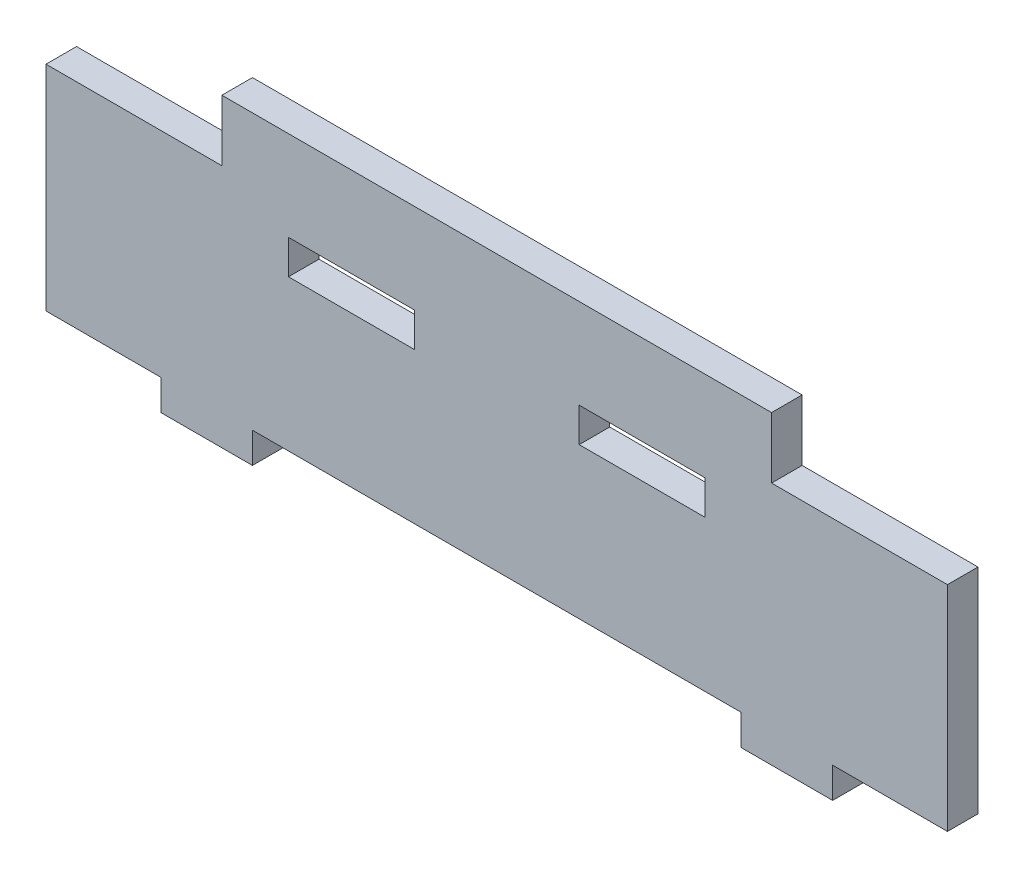
ISO-10303-21;
HEADER;
FILE_DESCRIPTION(('STEP AP214'),'2;1');
FILE_NAME('part.step','',(''),(''),'','','');
FILE_SCHEMA(('AUTOMOTIVE_DESIGN { 1 0 10303 214 1 1 1 1 }'));
ENDSEC;
DATA;
#1=APPLICATION_CONTEXT('core data for automotive mechanical design processes');
#2=APPLICATION_PROTOCOL_DEFINITION('international standard','automotive_design',2000,#1);
#3=PRODUCT_CONTEXT('',#1,'mechanical');
#4=PRODUCT('Part','Part','',(#3));
#5=PRODUCT_RELATED_PRODUCT_CATEGORY('part','',(#4));
#6=PRODUCT_DEFINITION_FORMATION('','',#4);
#7=PRODUCT_DEFINITION_CONTEXT('part definition',#1,'design');
#8=PRODUCT_DEFINITION('design','',#6,#7);
#9=PRODUCT_DEFINITION_SHAPE('','',#8);
#10=(LENGTH_UNIT() NAMED_UNIT(*) SI_UNIT(.MILLI.,.METRE.));
#11=(NAMED_UNIT(*) PLANE_ANGLE_UNIT() SI_UNIT($,.RADIAN.));
#12=(NAMED_UNIT(*) SI_UNIT($,.STERADIAN.) SOLID_ANGLE_UNIT());
#13=UNCERTAINTY_MEASURE_WITH_UNIT(LENGTH_MEASURE(1.E-05),#10,'distance_accuracy_value','');
#14=(GEOMETRIC_REPRESENTATION_CONTEXT(3) GLOBAL_UNCERTAINTY_ASSIGNED_CONTEXT((#13)) GLOBAL_UNIT_ASSIGNED_CONTEXT((#10,
#11,#12)) REPRESENTATION_CONTEXT('',''));
#15=CARTESIAN_POINT('',(0.,0.,0.));
#16=DIRECTION('',(0.,0.,1.));
#17=DIRECTION('',(1.,0.,0.));
#18=AXIS2_PLACEMENT_3D('',#15,#16,#17);
#19=CARTESIAN_POINT('',(0.,0.,5.));
#20=DIRECTION('',(0.,0.,1.));
#21=DIRECTION('',(1.,0.,0.));
#22=AXIS2_PLACEMENT_3D('',#19,#20,#21);
#23=PLANE('',#22);
#24=DIRECTION('',(0.,-1.,0.));
#25=VECTOR('',#24,1.);
#26=CARTESIAN_POINT('',(0.,0.,5.));
#27=LINE('',#26,#25);
#28=CARTESIAN_POINT('',(0.,35.,5.));
#29=VERTEX_POINT('',#28);
#30=CARTESIAN_POINT('',(0.,0.,5.));
#31=VERTEX_POINT('',#30);
#32=EDGE_CURVE('E263',#29,#31,#27,.T.);
#33=ORIENTED_EDGE('',*,*,#32,.T.);
#34=DIRECTION('',(1.,0.,0.));
#35=VECTOR('',#34,1.);
#36=CARTESIAN_POINT('',(0.,0.,5.));
#37=LINE('',#36,#35);
#38=CARTESIAN_POINT('',(18.8,0.,5.));
#39=VERTEX_POINT('',#38);
#40=EDGE_CURVE('E266',#31,#39,#37,.T.);
#41=ORIENTED_EDGE('',*,*,#40,.T.);
#42=DIRECTION('',(0.,-1.,0.));
#43=VECTOR('',#42,1.);
#44=CARTESIAN_POINT('',(18.8,-5.,5.));
#45=LINE('',#44,#43);
#46=CARTESIAN_POINT('',(18.8,-5.,5.));
#47=VERTEX_POINT('',#46);
#48=EDGE_CURVE('E269',#39,#47,#45,.T.);
#49=ORIENTED_EDGE('',*,*,#48,.T.);
#50=DIRECTION('',(1.,0.,0.));
#51=VECTOR('',#50,1.);
#52=CARTESIAN_POINT('',(18.8,-5.,5.));
#53=LINE('',#52,#51);
#54=CARTESIAN_POINT('',(33.8,-5.,5.));
#55=VERTEX_POINT('',#54);
#56=EDGE_CURVE('E271',#47,#55,#53,.T.);
#57=ORIENTED_EDGE('',*,*,#56,.T.);
#58=DIRECTION('',(0.,1.,0.));
#59=VECTOR('',#58,1.);
#60=CARTESIAN_POINT('',(33.8,-5.,5.));
#61=LINE('',#60,#59);
#62=CARTESIAN_POINT('',(33.8,0.,5.));
#63=VERTEX_POINT('',#62);
#64=EDGE_CURVE('E273',#55,#63,#61,.T.);
#65=ORIENTED_EDGE('',*,*,#64,.T.);
#66=DIRECTION('',(1.,0.,0.));
#67=VECTOR('',#66,1.);
#68=CARTESIAN_POINT('',(33.8,0.,5.));
#69=LINE('',#68,#67);
#70=CARTESIAN_POINT('',(113.8,0.,5.));
#71=VERTEX_POINT('',#70);
#72=EDGE_CURVE('E275',#63,#71,#69,.T.);
#73=ORIENTED_EDGE('',*,*,#72,.T.);
#74=DIRECTION('',(0.,-1.,0.));
#75=VECTOR('',#74,1.);
#76=CARTESIAN_POINT('',(113.8,-5.,5.));
#77=LINE('',#76,#75);
#78=CARTESIAN_POINT('',(113.8,-5.,5.));
#79=VERTEX_POINT('',#78);
#80=EDGE_CURVE('E277',#71,#79,#77,.T.);
#81=ORIENTED_EDGE('',*,*,#80,.T.);
#82=DIRECTION('',(1.,0.,0.));
#83=VECTOR('',#82,1.);
#84=CARTESIAN_POINT('',(128.8,-5.,5.));
#85=LINE('',#84,#83);
#86=CARTESIAN_POINT('',(128.8,-5.,5.));
#87=VERTEX_POINT('',#86);
#88=EDGE_CURVE('E279',#79,#87,#85,.T.);
#89=ORIENTED_EDGE('',*,*,#88,.T.);
#90=DIRECTION('',(0.,1.,0.));
#91=VECTOR('',#90,1.);
#92=CARTESIAN_POINT('',(128.8,-5.,5.));
#93=LINE('',#92,#91);
#94=CARTESIAN_POINT('',(128.8,0.,5.));
#95=VERTEX_POINT('',#94);
#96=EDGE_CURVE('E281',#87,#95,#93,.T.);
#97=ORIENTED_EDGE('',*,*,#96,.T.);
#98=DIRECTION('',(1.,0.,0.));
#99=VECTOR('',#98,1.);
#100=CARTESIAN_POINT('',(128.8,0.,5.));
#101=LINE('',#100,#99);
#102=CARTESIAN_POINT('',(147.6,0.,5.));
#103=VERTEX_POINT('',#102);
#104=EDGE_CURVE('E283',#95,#103,#101,.T.);
#105=ORIENTED_EDGE('',*,*,#104,.T.);
#106=DIRECTION('',(0.,1.,0.));
#107=VECTOR('',#106,1.);
#108=CARTESIAN_POINT('',(147.6,0.,5.));
#109=LINE('',#108,#107);
#110=CARTESIAN_POINT('',(147.6,35.,5.));
#111=VERTEX_POINT('',#110);
#112=EDGE_CURVE('E285',#103,#111,#109,.T.);
#113=ORIENTED_EDGE('',*,*,#112,.T.);
#114=DIRECTION('',(-1.,0.,0.));
#115=VECTOR('',#114,1.);
#116=CARTESIAN_POINT('',(118.8,35.,5.));
#117=LINE('',#116,#115);
#118=CARTESIAN_POINT('',(118.8,35.,5.));
#119=VERTEX_POINT('',#118);
#120=EDGE_CURVE('E287',#111,#119,#117,.T.);
#121=ORIENTED_EDGE('',*,*,#120,.T.);
#122=DIRECTION('',(0.,1.,0.));
#123=VECTOR('',#122,1.);
#124=CARTESIAN_POINT('',(118.8,45.,5.));
#125=LINE('',#124,#123);
#126=CARTESIAN_POINT('',(118.8,45.,5.));
#127=VERTEX_POINT('',#126);
#128=EDGE_CURVE('E289',#119,#127,#125,.T.);
#129=ORIENTED_EDGE('',*,*,#128,.T.);
#130=DIRECTION('',(-1.,0.,0.));
#131=VECTOR('',#130,1.);
#132=CARTESIAN_POINT('',(28.8,45.,5.));
#133=LINE('',#132,#131);
#134=CARTESIAN_POINT('',(28.8,45.,5.));
#135=VERTEX_POINT('',#134);
#136=EDGE_CURVE('E291',#127,#135,#133,.T.);
#137=ORIENTED_EDGE('',*,*,#136,.T.);
#138=DIRECTION('',(0.,-1.,0.));
#139=VECTOR('',#138,1.);
#140=CARTESIAN_POINT('',(28.8,45.,5.));
#141=LINE('',#140,#139);
#142=CARTESIAN_POINT('',(28.8,35.,5.));
#143=VERTEX_POINT('',#142);
#144=EDGE_CURVE('E293',#135,#143,#141,.T.);
#145=ORIENTED_EDGE('',*,*,#144,.T.);
#146=DIRECTION('',(-1.,0.,0.));
#147=VECTOR('',#146,1.);
#148=CARTESIAN_POINT('',(28.8,35.,5.));
#149=LINE('',#148,#147);
#150=EDGE_CURVE('E295',#143,#29,#149,.T.);
#151=ORIENTED_EDGE('',*,*,#150,.T.);
#152=EDGE_LOOP('',(#33,#41,#49,#57,#65,#73,#81,#89,#97,#105,#113,#121,#129,#137,#145,#151));
#153=FACE_BOUND('',#152,.T.);
#154=DIRECTION('',(0.,-1.,0.));
#155=VECTOR('',#154,1.);
#156=CARTESIAN_POINT('',(39.7,30.3,5.));
#157=LINE('',#156,#155);
#158=CARTESIAN_POINT('',(39.7,30.3,5.));
#159=VERTEX_POINT('',#158);
#160=CARTESIAN_POINT('',(39.7,24.7,5.));
#161=VERTEX_POINT('',#160);
#162=EDGE_CURVE('E234',#159,#161,#157,.T.);
#163=ORIENTED_EDGE('',*,*,#162,.F.);
#164=DIRECTION('',(-1.,0.,0.));
#165=VECTOR('',#164,1.);
#166=CARTESIAN_POINT('',(39.7,30.3,5.));
#167=LINE('',#166,#165);
#168=CARTESIAN_POINT('',(60.3,30.3,5.));
#169=VERTEX_POINT('',#168);
#170=EDGE_CURVE('E232',#169,#159,#167,.T.);
#171=ORIENTED_EDGE('',*,*,#170,.F.);
#172=DIRECTION('',(0.,1.,0.));
#173=VECTOR('',#172,1.);
#174=CARTESIAN_POINT('',(60.3,30.3,5.));
#175=LINE('',#174,#173);
#176=CARTESIAN_POINT('',(60.3,24.7,5.));
#177=VERTEX_POINT('',#176);
#178=EDGE_CURVE('E240',#177,#169,#175,.T.);
#179=ORIENTED_EDGE('',*,*,#178,.F.);
#180=DIRECTION('',(1.,0.,0.));
#181=VECTOR('',#180,1.);
#182=CARTESIAN_POINT('',(39.7,24.7,5.));
#183=LINE('',#182,#181);
#184=EDGE_CURVE('E237',#161,#177,#183,.T.);
#185=ORIENTED_EDGE('',*,*,#184,.F.);
#186=EDGE_LOOP('',(#163,#171,#179,#185));
#187=FACE_BOUND('',#186,.T.);
#188=DIRECTION('',(-1.,0.,0.));
#189=VECTOR('',#188,1.);
#190=CARTESIAN_POINT('',(107.9,30.3,5.));
#191=LINE('',#190,#189);
#192=CARTESIAN_POINT('',(107.9,30.3,5.));
#193=VERTEX_POINT('',#192);
#194=CARTESIAN_POINT('',(87.3,30.3,5.));
#195=VERTEX_POINT('',#194);
#196=EDGE_CURVE('E204',#193,#195,#191,.T.);
#197=ORIENTED_EDGE('',*,*,#196,.F.);
#198=DIRECTION('',(0.,1.,0.));
#199=VECTOR('',#198,1.);
#200=CARTESIAN_POINT('',(107.9,30.3,5.));
#201=LINE('',#200,#199);
#202=CARTESIAN_POINT('',(107.9,24.7,5.));
#203=VERTEX_POINT('',#202);
#204=EDGE_CURVE('E196',#203,#193,#201,.T.);
#205=ORIENTED_EDGE('',*,*,#204,.F.);
#206=DIRECTION('',(1.,0.,0.));
#207=VECTOR('',#206,1.);
#208=CARTESIAN_POINT('',(107.9,24.7,5.));
#209=LINE('',#208,#207);
#210=CARTESIAN_POINT('',(87.3,24.7,5.));
#211=VERTEX_POINT('',#210);
#212=EDGE_CURVE('E218',#211,#203,#209,.T.);
#213=ORIENTED_EDGE('',*,*,#212,.F.);
#214=DIRECTION('',(0.,-1.,0.));
#215=VECTOR('',#214,1.);
#216=CARTESIAN_POINT('',(87.3,30.3,5.));
#217=LINE('',#216,#215);
#218=EDGE_CURVE('E216',#195,#211,#217,.T.);
#219=ORIENTED_EDGE('',*,*,#218,.F.);
#220=EDGE_LOOP('',(#197,#205,#213,#219));
#221=FACE_BOUND('',#220,.T.);
#222=ADVANCED_FACE('F35',(#153,#187,#221),#23,.T.);
#223=CARTESIAN_POINT('',(0.,0.,0.));
#224=DIRECTION('',(0.,0.,1.));
#225=DIRECTION('',(1.,0.,0.));
#226=AXIS2_PLACEMENT_3D('',#223,#224,#225);
#227=PLANE('',#226);
#228=DIRECTION('',(-1.,0.,0.));
#229=VECTOR('',#228,1.);
#230=CARTESIAN_POINT('',(39.7,30.3,0.));
#231=LINE('',#230,#229);
#232=CARTESIAN_POINT('',(60.3,30.3,0.));
#233=VERTEX_POINT('',#232);
#234=CARTESIAN_POINT('',(39.7,30.3,0.));
#235=VERTEX_POINT('',#234);
#236=EDGE_CURVE('E212',#233,#235,#231,.T.);
#237=ORIENTED_EDGE('',*,*,#236,.T.);
#238=DIRECTION('',(0.,-1.,0.));
#239=VECTOR('',#238,1.);
#240=CARTESIAN_POINT('',(39.7,30.3,0.));
#241=LINE('',#240,#239);
#242=CARTESIAN_POINT('',(39.7,24.7,0.));
#243=VERTEX_POINT('',#242);
#244=EDGE_CURVE('E245',#235,#243,#241,.T.);
#245=ORIENTED_EDGE('',*,*,#244,.T.);
#246=DIRECTION('',(1.,0.,0.));
#247=VECTOR('',#246,1.);
#248=CARTESIAN_POINT('',(39.7,24.7,0.));
#249=LINE('',#248,#247);
#250=CARTESIAN_POINT('',(60.3,24.7,0.));
#251=VERTEX_POINT('',#250);
#252=EDGE_CURVE('E248',#243,#251,#249,.T.);
#253=ORIENTED_EDGE('',*,*,#252,.T.);
#254=DIRECTION('',(0.,1.,0.));
#255=VECTOR('',#254,1.);
#256=CARTESIAN_POINT('',(60.3,30.3,0.));
#257=LINE('',#256,#255);
#258=EDGE_CURVE('E235',#251,#233,#257,.T.);
#259=ORIENTED_EDGE('',*,*,#258,.T.);
#260=EDGE_LOOP('',(#237,#245,#253,#259));
#261=FACE_BOUND('',#260,.T.);
#262=DIRECTION('',(0.,-1.,0.));
#263=VECTOR('',#262,1.);
#264=CARTESIAN_POINT('',(0.,0.,0.));
#265=LINE('',#264,#263);
#266=CARTESIAN_POINT('',(0.,35.,0.));
#267=VERTEX_POINT('',#266);
#268=CARTESIAN_POINT('',(0.,0.,0.));
#269=VERTEX_POINT('',#268);
#270=EDGE_CURVE('E262',#267,#269,#265,.T.);
#271=ORIENTED_EDGE('',*,*,#270,.F.);
#272=DIRECTION('',(-1.,0.,0.));
#273=VECTOR('',#272,1.);
#274=CARTESIAN_POINT('',(28.8,35.,0.));
#275=LINE('',#274,#273);
#276=CARTESIAN_POINT('',(28.8,35.,0.));
#277=VERTEX_POINT('',#276);
#278=EDGE_CURVE('E267',#277,#267,#275,.T.);
#279=ORIENTED_EDGE('',*,*,#278,.F.);
#280=DIRECTION('',(0.,-1.,0.));
#281=VECTOR('',#280,1.);
#282=CARTESIAN_POINT('',(28.8,45.,0.));
#283=LINE('',#282,#281);
#284=CARTESIAN_POINT('',(28.8,45.,0.));
#285=VERTEX_POINT('',#284);
#286=EDGE_CURVE('E326',#285,#277,#283,.T.);
#287=ORIENTED_EDGE('',*,*,#286,.F.);
#288=DIRECTION('',(-1.,0.,0.));
#289=VECTOR('',#288,1.);
#290=CARTESIAN_POINT('',(28.8,45.,0.));
#291=LINE('',#290,#289);
#292=CARTESIAN_POINT('',(118.8,45.,0.));
#293=VERTEX_POINT('',#292);
#294=EDGE_CURVE('E324',#293,#285,#291,.T.);
#295=ORIENTED_EDGE('',*,*,#294,.F.);
#296=DIRECTION('',(0.,1.,0.));
#297=VECTOR('',#296,1.);
#298=CARTESIAN_POINT('',(118.8,45.,0.));
#299=LINE('',#298,#297);
#300=CARTESIAN_POINT('',(118.8,35.,0.));
#301=VERTEX_POINT('',#300);
#302=EDGE_CURVE('E322',#301,#293,#299,.T.);
#303=ORIENTED_EDGE('',*,*,#302,.F.);
#304=DIRECTION('',(-1.,0.,0.));
#305=VECTOR('',#304,1.);
#306=CARTESIAN_POINT('',(118.8,35.,0.));
#307=LINE('',#306,#305);
#308=CARTESIAN_POINT('',(147.6,35.,0.));
#309=VERTEX_POINT('',#308);
#310=EDGE_CURVE('E320',#309,#301,#307,.T.);
#311=ORIENTED_EDGE('',*,*,#310,.F.);
#312=DIRECTION('',(0.,1.,0.));
#313=VECTOR('',#312,1.);
#314=CARTESIAN_POINT('',(147.6,0.,0.));
#315=LINE('',#314,#313);
#316=CARTESIAN_POINT('',(147.6,0.,0.));
#317=VERTEX_POINT('',#316);
#318=EDGE_CURVE('E318',#317,#309,#315,.T.);
#319=ORIENTED_EDGE('',*,*,#318,.F.);
#320=DIRECTION('',(1.,0.,0.));
#321=VECTOR('',#320,1.);
#322=CARTESIAN_POINT('',(128.8,0.,0.));
#323=LINE('',#322,#321);
#324=CARTESIAN_POINT('',(128.8,0.,0.));
#325=VERTEX_POINT('',#324);
#326=EDGE_CURVE('E316',#325,#317,#323,.T.);
#327=ORIENTED_EDGE('',*,*,#326,.F.);
#328=DIRECTION('',(0.,1.,0.));
#329=VECTOR('',#328,1.);
#330=CARTESIAN_POINT('',(128.8,-5.,0.));
#331=LINE('',#330,#329);
#332=CARTESIAN_POINT('',(128.8,-5.,0.));
#333=VERTEX_POINT('',#332);
#334=EDGE_CURVE('E314',#333,#325,#331,.T.);
#335=ORIENTED_EDGE('',*,*,#334,.F.);
#336=DIRECTION('',(1.,0.,0.));
#337=VECTOR('',#336,1.);
#338=CARTESIAN_POINT('',(128.8,-5.,0.));
#339=LINE('',#338,#337);
#340=CARTESIAN_POINT('',(113.8,-5.,0.));
#341=VERTEX_POINT('',#340);
#342=EDGE_CURVE('E312',#341,#333,#339,.T.);
#343=ORIENTED_EDGE('',*,*,#342,.F.);
#344=DIRECTION('',(0.,-1.,0.));
#345=VECTOR('',#344,1.);
#346=CARTESIAN_POINT('',(113.8,-5.,0.));
#347=LINE('',#346,#345);
#348=CARTESIAN_POINT('',(113.8,0.,0.));
#349=VERTEX_POINT('',#348);
#350=EDGE_CURVE('E310',#349,#341,#347,.T.);
#351=ORIENTED_EDGE('',*,*,#350,.F.);
#352=DIRECTION('',(1.,0.,0.));
#353=VECTOR('',#352,1.);
#354=CARTESIAN_POINT('',(33.8,0.,0.));
#355=LINE('',#354,#353);
#356=CARTESIAN_POINT('',(33.8,0.,0.));
#357=VERTEX_POINT('',#356);
#358=EDGE_CURVE('E308',#357,#349,#355,.T.);
#359=ORIENTED_EDGE('',*,*,#358,.F.);
#360=DIRECTION('',(0.,1.,0.));
#361=VECTOR('',#360,1.);
#362=CARTESIAN_POINT('',(33.8,-5.,0.));
#363=LINE('',#362,#361);
#364=CARTESIAN_POINT('',(33.8,-5.,0.));
#365=VERTEX_POINT('',#364);
#366=EDGE_CURVE('E306',#365,#357,#363,.T.);
#367=ORIENTED_EDGE('',*,*,#366,.F.);
#368=DIRECTION('',(1.,0.,0.));
#369=VECTOR('',#368,1.);
#370=CARTESIAN_POINT('',(18.8,-5.,0.));
#371=LINE('',#370,#369);
#372=CARTESIAN_POINT('',(18.8,-5.,0.));
#373=VERTEX_POINT('',#372);
#374=EDGE_CURVE('E304',#373,#365,#371,.T.);
#375=ORIENTED_EDGE('',*,*,#374,.F.);
#376=DIRECTION('',(0.,-1.,0.));
#377=VECTOR('',#376,1.);
#378=CARTESIAN_POINT('',(18.8,-5.,0.));
#379=LINE('',#378,#377);
#380=CARTESIAN_POINT('',(18.8,0.,0.));
#381=VERTEX_POINT('',#380);
#382=EDGE_CURVE('E302',#381,#373,#379,.T.);
#383=ORIENTED_EDGE('',*,*,#382,.F.);
#384=DIRECTION('',(1.,0.,0.));
#385=VECTOR('',#384,1.);
#386=CARTESIAN_POINT('',(0.,0.,0.));
#387=LINE('',#386,#385);
#388=EDGE_CURVE('E300',#269,#381,#387,.T.);
#389=ORIENTED_EDGE('',*,*,#388,.F.);
#390=EDGE_LOOP('',(#271,#279,#287,#295,#303,#311,#319,#327,#335,#343,#351,#359,#367,#375,#383,#389));
#391=FACE_BOUND('',#390,.T.);
#392=DIRECTION('',(0.,1.,0.));
#393=VECTOR('',#392,1.);
#394=CARTESIAN_POINT('',(107.9,30.3,0.));
#395=LINE('',#394,#393);
#396=CARTESIAN_POINT('',(107.9,24.7,0.));
#397=VERTEX_POINT('',#396);
#398=CARTESIAN_POINT('',(107.9,30.3,0.));
#399=VERTEX_POINT('',#398);
#400=EDGE_CURVE('E58',#397,#399,#395,.T.);
#401=ORIENTED_EDGE('',*,*,#400,.T.);
#402=DIRECTION('',(-1.,0.,0.));
#403=VECTOR('',#402,1.);
#404=CARTESIAN_POINT('',(107.9,30.3,0.));
#405=LINE('',#404,#403);
#406=CARTESIAN_POINT('',(87.3,30.3,0.));
#407=VERTEX_POINT('',#406);
#408=EDGE_CURVE('E211',#399,#407,#405,.T.);
#409=ORIENTED_EDGE('',*,*,#408,.T.);
#410=DIRECTION('',(0.,-1.,0.));
#411=VECTOR('',#410,1.);
#412=CARTESIAN_POINT('',(87.3,30.3,0.));
#413=LINE('',#412,#411);
#414=CARTESIAN_POINT('',(87.3,24.7,0.));
#415=VERTEX_POINT('',#414);
#416=EDGE_CURVE('E224',#407,#415,#413,.T.);
#417=ORIENTED_EDGE('',*,*,#416,.T.);
#418=DIRECTION('',(1.,0.,0.));
#419=VECTOR('',#418,1.);
#420=CARTESIAN_POINT('',(107.9,24.7,0.));
#421=LINE('',#420,#419);
#422=EDGE_CURVE('E205',#415,#397,#421,.T.);
#423=ORIENTED_EDGE('',*,*,#422,.T.);
#424=EDGE_LOOP('',(#401,#409,#417,#423));
#425=FACE_BOUND('',#424,.T.);
#426=ADVANCED_FACE('F380',(#261,#391,#425),#227,.F.);
#427=CARTESIAN_POINT('',(0.,0.,5.));
#428=DIRECTION('',(1.,0.,0.));
#429=DIRECTION('',(0.,0.,-1.));
#430=AXIS2_PLACEMENT_3D('',#427,#428,#429);
#431=PLANE('',#430);
#432=ORIENTED_EDGE('',*,*,#270,.T.);
#433=DIRECTION('',(0.,0.,-1.));
#434=VECTOR('',#433,1.);
#435=CARTESIAN_POINT('',(0.,0.,5.));
#436=LINE('',#435,#434);
#437=EDGE_CURVE('E11',#31,#269,#436,.T.);
#438=ORIENTED_EDGE('',*,*,#437,.F.);
#439=ORIENTED_EDGE('',*,*,#32,.F.);
#440=DIRECTION('',(0.,0.,-1.));
#441=VECTOR('',#440,1.);
#442=CARTESIAN_POINT('',(0.,35.,5.));
#443=LINE('',#442,#441);
#444=EDGE_CURVE('E297',#29,#267,#443,.T.);
#445=ORIENTED_EDGE('',*,*,#444,.T.);
#446=EDGE_LOOP('',(#432,#438,#439,#445));
#447=FACE_BOUND('',#446,.T.);
#448=ADVANCED_FACE('F37',(#447),#431,.F.);
#449=CARTESIAN_POINT('',(0.,0.,5.));
#450=DIRECTION('',(0.,1.,0.));
#451=DIRECTION('',(0.,0.,1.));
#452=AXIS2_PLACEMENT_3D('',#449,#450,#451);
#453=PLANE('',#452);
#454=ORIENTED_EDGE('',*,*,#388,.T.);
#455=DIRECTION('',(0.,0.,-1.));
#456=VECTOR('',#455,1.);
#457=CARTESIAN_POINT('',(18.8,0.,5.));
#458=LINE('',#457,#456);
#459=EDGE_CURVE('E43',#39,#381,#458,.T.);
#460=ORIENTED_EDGE('',*,*,#459,.F.);
#461=ORIENTED_EDGE('',*,*,#40,.F.);
#462=ORIENTED_EDGE('',*,*,#437,.T.);
#463=EDGE_LOOP('',(#454,#460,#461,#462));
#464=FACE_BOUND('',#463,.T.);
#465=ADVANCED_FACE('F398',(#464),#453,.F.);
#466=CARTESIAN_POINT('',(18.8,-5.,5.));
#467=DIRECTION('',(1.,0.,0.));
#468=DIRECTION('',(0.,0.,-1.));
#469=AXIS2_PLACEMENT_3D('',#466,#467,#468);
#470=PLANE('',#469);
#471=ORIENTED_EDGE('',*,*,#382,.T.);
#472=DIRECTION('',(0.,0.,-1.));
#473=VECTOR('',#472,1.);
#474=CARTESIAN_POINT('',(18.8,-5.,5.));
#475=LINE('',#474,#473);
#476=EDGE_CURVE('E367',#47,#373,#475,.T.);
#477=ORIENTED_EDGE('',*,*,#476,.F.);
#478=ORIENTED_EDGE('',*,*,#48,.F.);
#479=ORIENTED_EDGE('',*,*,#459,.T.);
#480=EDGE_LOOP('',(#471,#477,#478,#479));
#481=FACE_BOUND('',#480,.T.);
#482=ADVANCED_FACE('F374',(#481),#470,.F.);
#483=CARTESIAN_POINT('',(18.8,-5.,5.));
#484=DIRECTION('',(0.,1.,0.));
#485=DIRECTION('',(0.,0.,1.));
#486=AXIS2_PLACEMENT_3D('',#483,#484,#485);
#487=PLANE('',#486);
#488=ORIENTED_EDGE('',*,*,#374,.T.);
#489=DIRECTION('',(0.,0.,-1.));
#490=VECTOR('',#489,1.);
#491=CARTESIAN_POINT('',(33.8,-5.,5.));
#492=LINE('',#491,#490);
#493=EDGE_CURVE('E364',#55,#365,#492,.T.);
#494=ORIENTED_EDGE('',*,*,#493,.F.);
#495=ORIENTED_EDGE('',*,*,#56,.F.);
#496=ORIENTED_EDGE('',*,*,#476,.T.);
#497=EDGE_LOOP('',(#488,#494,#495,#496));
#498=FACE_BOUND('',#497,.T.);
#499=ADVANCED_FACE('F386',(#498),#487,.F.);
#500=CARTESIAN_POINT('',(33.8,-5.,5.));
#501=DIRECTION('',(-1.,0.,0.));
#502=DIRECTION('',(0.,0.,1.));
#503=AXIS2_PLACEMENT_3D('',#500,#501,#502);
#504=PLANE('',#503);
#505=ORIENTED_EDGE('',*,*,#366,.T.);
#506=DIRECTION('',(0.,0.,-1.));
#507=VECTOR('',#506,1.);
#508=CARTESIAN_POINT('',(33.8,0.,5.));
#509=LINE('',#508,#507);
#510=EDGE_CURVE('E361',#63,#357,#509,.T.);
#511=ORIENTED_EDGE('',*,*,#510,.F.);
#512=ORIENTED_EDGE('',*,*,#64,.F.);
#513=ORIENTED_EDGE('',*,*,#493,.T.);
#514=EDGE_LOOP('',(#505,#511,#512,#513));
#515=FACE_BOUND('',#514,.T.);
#516=ADVANCED_FACE('F390',(#515),#504,.F.);
#517=CARTESIAN_POINT('',(33.8,0.,5.));
#518=DIRECTION('',(0.,1.,0.));
#519=DIRECTION('',(0.,0.,1.));
#520=AXIS2_PLACEMENT_3D('',#517,#518,#519);
#521=PLANE('',#520);
#522=ORIENTED_EDGE('',*,*,#358,.T.);
#523=DIRECTION('',(0.,0.,-1.));
#524=VECTOR('',#523,1.);
#525=CARTESIAN_POINT('',(113.8,0.,5.));
#526=LINE('',#525,#524);
#527=EDGE_CURVE('E358',#71,#349,#526,.T.);
#528=ORIENTED_EDGE('',*,*,#527,.F.);
#529=ORIENTED_EDGE('',*,*,#72,.F.);
#530=ORIENTED_EDGE('',*,*,#510,.T.);
#531=EDGE_LOOP('',(#522,#528,#529,#530));
#532=FACE_BOUND('',#531,.T.);
#533=ADVANCED_FACE('F451',(#532),#521,.F.);
#534=CARTESIAN_POINT('',(113.8,-5.,5.));
#535=DIRECTION('',(1.,0.,0.));
#536=DIRECTION('',(0.,0.,-1.));
#537=AXIS2_PLACEMENT_3D('',#534,#535,#536);
#538=PLANE('',#537);
#539=ORIENTED_EDGE('',*,*,#350,.T.);
#540=DIRECTION('',(0.,0.,-1.));
#541=VECTOR('',#540,1.);
#542=CARTESIAN_POINT('',(113.8,-5.,5.));
#543=LINE('',#542,#541);
#544=EDGE_CURVE('E355',#79,#341,#543,.T.);
#545=ORIENTED_EDGE('',*,*,#544,.F.);
#546=ORIENTED_EDGE('',*,*,#80,.F.);
#547=ORIENTED_EDGE('',*,*,#527,.T.);
#548=EDGE_LOOP('',(#539,#545,#546,#547));
#549=FACE_BOUND('',#548,.T.);
#550=ADVANCED_FACE('F448',(#549),#538,.F.);
#551=CARTESIAN_POINT('',(128.8,-5.,5.));
#552=DIRECTION('',(0.,1.,0.));
#553=DIRECTION('',(0.,0.,1.));
#554=AXIS2_PLACEMENT_3D('',#551,#552,#553);
#555=PLANE('',#554);
#556=ORIENTED_EDGE('',*,*,#342,.T.);
#557=DIRECTION('',(0.,0.,-1.));
#558=VECTOR('',#557,1.);
#559=CARTESIAN_POINT('',(128.8,-5.,5.));
#560=LINE('',#559,#558);
#561=EDGE_CURVE('E352',#87,#333,#560,.T.);
#562=ORIENTED_EDGE('',*,*,#561,.F.);
#563=ORIENTED_EDGE('',*,*,#88,.F.);
#564=ORIENTED_EDGE('',*,*,#544,.T.);
#565=EDGE_LOOP('',(#556,#562,#563,#564));
#566=FACE_BOUND('',#565,.T.);
#567=ADVANCED_FACE('F444',(#566),#555,.F.);
#568=CARTESIAN_POINT('',(128.8,-5.,5.));
#569=DIRECTION('',(-1.,0.,0.));
#570=DIRECTION('',(0.,0.,1.));
#571=AXIS2_PLACEMENT_3D('',#568,#569,#570);
#572=PLANE('',#571);
#573=ORIENTED_EDGE('',*,*,#334,.T.);
#574=DIRECTION('',(0.,0.,-1.));
#575=VECTOR('',#574,1.);
#576=CARTESIAN_POINT('',(128.8,0.,5.));
#577=LINE('',#576,#575);
#578=EDGE_CURVE('E349',#95,#325,#577,.T.);
#579=ORIENTED_EDGE('',*,*,#578,.F.);
#580=ORIENTED_EDGE('',*,*,#96,.F.);
#581=ORIENTED_EDGE('',*,*,#561,.T.);
#582=EDGE_LOOP('',(#573,#579,#580,#581));
#583=FACE_BOUND('',#582,.T.);
#584=ADVANCED_FACE('F440',(#583),#572,.F.);
#585=CARTESIAN_POINT('',(128.8,0.,5.));
#586=DIRECTION('',(0.,1.,0.));
#587=DIRECTION('',(0.,0.,1.));
#588=AXIS2_PLACEMENT_3D('',#585,#586,#587);
#589=PLANE('',#588);
#590=ORIENTED_EDGE('',*,*,#326,.T.);
#591=DIRECTION('',(0.,0.,-1.));
#592=VECTOR('',#591,1.);
#593=CARTESIAN_POINT('',(147.6,0.,5.));
#594=LINE('',#593,#592);
#595=EDGE_CURVE('E346',#103,#317,#594,.T.);
#596=ORIENTED_EDGE('',*,*,#595,.F.);
#597=ORIENTED_EDGE('',*,*,#104,.F.);
#598=ORIENTED_EDGE('',*,*,#578,.T.);
#599=EDGE_LOOP('',(#590,#596,#597,#598));
#600=FACE_BOUND('',#599,.T.);
#601=ADVANCED_FACE('F435',(#600),#589,.F.);
#602=CARTESIAN_POINT('',(147.6,0.,5.));
#603=DIRECTION('',(-1.,0.,0.));
#604=DIRECTION('',(0.,0.,1.));
#605=AXIS2_PLACEMENT_3D('',#602,#603,#604);
#606=PLANE('',#605);
#607=ORIENTED_EDGE('',*,*,#318,.T.);
#608=DIRECTION('',(0.,0.,-1.));
#609=VECTOR('',#608,1.);
#610=CARTESIAN_POINT('',(147.6,35.,5.));
#611=LINE('',#610,#609);
#612=EDGE_CURVE('E343',#111,#309,#611,.T.);
#613=ORIENTED_EDGE('',*,*,#612,.F.);
#614=ORIENTED_EDGE('',*,*,#112,.F.);
#615=ORIENTED_EDGE('',*,*,#595,.T.);
#616=EDGE_LOOP('',(#607,#613,#614,#615));
#617=FACE_BOUND('',#616,.T.);
#618=ADVANCED_FACE('F429',(#617),#606,.F.);
#619=CARTESIAN_POINT('',(118.8,35.,5.));
#620=DIRECTION('',(0.,-1.,0.));
#621=DIRECTION('',(0.,0.,-1.));
#622=AXIS2_PLACEMENT_3D('',#619,#620,#621);
#623=PLANE('',#622);
#624=ORIENTED_EDGE('',*,*,#310,.T.);
#625=DIRECTION('',(0.,0.,-1.));
#626=VECTOR('',#625,1.);
#627=CARTESIAN_POINT('',(118.8,35.,5.));
#628=LINE('',#627,#626);
#629=EDGE_CURVE('E340',#119,#301,#628,.T.);
#630=ORIENTED_EDGE('',*,*,#629,.F.);
#631=ORIENTED_EDGE('',*,*,#120,.F.);
#632=ORIENTED_EDGE('',*,*,#612,.T.);
#633=EDGE_LOOP('',(#624,#630,#631,#632));
#634=FACE_BOUND('',#633,.T.);
#635=ADVANCED_FACE('F425',(#634),#623,.F.);
#636=CARTESIAN_POINT('',(118.8,45.,5.));
#637=DIRECTION('',(-1.,0.,0.));
#638=DIRECTION('',(0.,-1.,0.));
#639=AXIS2_PLACEMENT_3D('',#636,#637,#638);
#640=PLANE('',#639);
#641=ORIENTED_EDGE('',*,*,#302,.T.);
#642=DIRECTION('',(0.,0.,-1.));
#643=VECTOR('',#642,1.);
#644=CARTESIAN_POINT('',(118.8,45.,5.));
#645=LINE('',#644,#643);
#646=EDGE_CURVE('E337',#127,#293,#645,.T.);
#647=ORIENTED_EDGE('',*,*,#646,.F.);
#648=ORIENTED_EDGE('',*,*,#128,.F.);
#649=ORIENTED_EDGE('',*,*,#629,.T.);
#650=EDGE_LOOP('',(#641,#647,#648,#649));
#651=FACE_BOUND('',#650,.T.);
#652=ADVANCED_FACE('F420',(#651),#640,.F.);
#653=CARTESIAN_POINT('',(28.8,45.,5.));
#654=DIRECTION('',(0.,-1.,0.));
#655=DIRECTION('',(1.,0.,0.));
#656=AXIS2_PLACEMENT_3D('',#653,#654,#655);
#657=PLANE('',#656);
#658=ORIENTED_EDGE('',*,*,#294,.T.);
#659=DIRECTION('',(0.,0.,-1.));
#660=VECTOR('',#659,1.);
#661=CARTESIAN_POINT('',(28.8,45.,5.));
#662=LINE('',#661,#660);
#663=EDGE_CURVE('E334',#135,#285,#662,.T.);
#664=ORIENTED_EDGE('',*,*,#663,.F.);
#665=ORIENTED_EDGE('',*,*,#136,.F.);
#666=ORIENTED_EDGE('',*,*,#646,.T.);
#667=EDGE_LOOP('',(#658,#664,#665,#666));
#668=FACE_BOUND('',#667,.T.);
#669=ADVANCED_FACE('F414',(#668),#657,.F.);
#670=CARTESIAN_POINT('',(28.8,45.,5.));
#671=DIRECTION('',(1.,0.,0.));
#672=DIRECTION('',(0.,1.,0.));
#673=AXIS2_PLACEMENT_3D('',#670,#671,#672);
#674=PLANE('',#673);
#675=ORIENTED_EDGE('',*,*,#286,.T.);
#676=DIRECTION('',(0.,0.,-1.));
#677=VECTOR('',#676,1.);
#678=CARTESIAN_POINT('',(28.8,35.,5.));
#679=LINE('',#678,#677);
#680=EDGE_CURVE('E331',#143,#277,#679,.T.);
#681=ORIENTED_EDGE('',*,*,#680,.F.);
#682=ORIENTED_EDGE('',*,*,#144,.F.);
#683=ORIENTED_EDGE('',*,*,#663,.T.);
#684=EDGE_LOOP('',(#675,#681,#682,#683));
#685=FACE_BOUND('',#684,.T.);
#686=ADVANCED_FACE('F410',(#685),#674,.F.);
#687=CARTESIAN_POINT('',(28.8,35.,5.));
#688=DIRECTION('',(0.,-1.,0.));
#689=DIRECTION('',(1.,0.,0.));
#690=AXIS2_PLACEMENT_3D('',#687,#688,#689);
#691=PLANE('',#690);
#692=ORIENTED_EDGE('',*,*,#278,.T.);
#693=ORIENTED_EDGE('',*,*,#444,.F.);
#694=ORIENTED_EDGE('',*,*,#150,.F.);
#695=ORIENTED_EDGE('',*,*,#680,.T.);
#696=EDGE_LOOP('',(#692,#693,#694,#695));
#697=FACE_BOUND('',#696,.T.);
#698=ADVANCED_FACE('F405',(#697),#691,.F.);
#699=CARTESIAN_POINT('',(39.7,30.3,5.));
#700=DIRECTION('',(0.,-1.,0.));
#701=DIRECTION('',(0.,0.,-1.));
#702=AXIS2_PLACEMENT_3D('',#699,#700,#701);
#703=PLANE('',#702);
#704=ORIENTED_EDGE('',*,*,#236,.F.);
#705=DIRECTION('',(0.,0.,-1.));
#706=VECTOR('',#705,1.);
#707=CARTESIAN_POINT('',(60.3,30.3,5.));
#708=LINE('',#707,#706);
#709=EDGE_CURVE('E242',#169,#233,#708,.T.);
#710=ORIENTED_EDGE('',*,*,#709,.F.);
#711=ORIENTED_EDGE('',*,*,#170,.T.);
#712=DIRECTION('',(0.,0.,-1.));
#713=VECTOR('',#712,1.);
#714=CARTESIAN_POINT('',(39.7,30.3,5.));
#715=LINE('',#714,#713);
#716=EDGE_CURVE('E259',#159,#235,#715,.T.);
#717=ORIENTED_EDGE('',*,*,#716,.T.);
#718=EDGE_LOOP('',(#704,#710,#711,#717));
#719=FACE_BOUND('',#718,.T.);
#720=ADVANCED_FACE('F468',(#719),#703,.T.);
#721=CARTESIAN_POINT('',(39.7,30.3,5.));
#722=DIRECTION('',(1.,0.,0.));
#723=DIRECTION('',(0.,0.,-1.));
#724=AXIS2_PLACEMENT_3D('',#721,#722,#723);
#725=PLANE('',#724);
#726=ORIENTED_EDGE('',*,*,#244,.F.);
#727=ORIENTED_EDGE('',*,*,#716,.F.);
#728=ORIENTED_EDGE('',*,*,#162,.T.);
#729=DIRECTION('',(0.,0.,-1.));
#730=VECTOR('',#729,1.);
#731=CARTESIAN_POINT('',(39.7,24.7,5.));
#732=LINE('',#731,#730);
#733=EDGE_CURVE('E257',#161,#243,#732,.T.);
#734=ORIENTED_EDGE('',*,*,#733,.T.);
#735=EDGE_LOOP('',(#726,#727,#728,#734));
#736=FACE_BOUND('',#735,.T.);
#737=ADVANCED_FACE('F530',(#736),#725,.T.);
#738=CARTESIAN_POINT('',(39.7,24.7,5.));
#739=DIRECTION('',(0.,1.,0.));
#740=DIRECTION('',(0.,0.,1.));
#741=AXIS2_PLACEMENT_3D('',#738,#739,#740);
#742=PLANE('',#741);
#743=ORIENTED_EDGE('',*,*,#252,.F.);
#744=ORIENTED_EDGE('',*,*,#733,.F.);
#745=ORIENTED_EDGE('',*,*,#184,.T.);
#746=DIRECTION('',(0.,0.,-1.));
#747=VECTOR('',#746,1.);
#748=CARTESIAN_POINT('',(60.3,24.7,5.));
#749=LINE('',#748,#747);
#750=EDGE_CURVE('E255',#177,#251,#749,.T.);
#751=ORIENTED_EDGE('',*,*,#750,.T.);
#752=EDGE_LOOP('',(#743,#744,#745,#751));
#753=FACE_BOUND('',#752,.T.);
#754=ADVANCED_FACE('F537',(#753),#742,.T.);
#755=CARTESIAN_POINT('',(60.3,30.3,5.));
#756=DIRECTION('',(-1.,0.,0.));
#757=DIRECTION('',(0.,0.,1.));
#758=AXIS2_PLACEMENT_3D('',#755,#756,#757);
#759=PLANE('',#758);
#760=ORIENTED_EDGE('',*,*,#258,.F.);
#761=ORIENTED_EDGE('',*,*,#750,.F.);
#762=ORIENTED_EDGE('',*,*,#178,.T.);
#763=ORIENTED_EDGE('',*,*,#709,.T.);
#764=EDGE_LOOP('',(#760,#761,#762,#763));
#765=FACE_BOUND('',#764,.T.);
#766=ADVANCED_FACE('F544',(#765),#759,.T.);
#767=CARTESIAN_POINT('',(107.9,30.3,5.));
#768=DIRECTION('',(-1.,0.,0.));
#769=DIRECTION('',(0.,0.,1.));
#770=AXIS2_PLACEMENT_3D('',#767,#768,#769);
#771=PLANE('',#770);
#772=ORIENTED_EDGE('',*,*,#400,.F.);
#773=DIRECTION('',(0.,0.,-1.));
#774=VECTOR('',#773,1.);
#775=CARTESIAN_POINT('',(107.9,24.7,5.));
#776=LINE('',#775,#774);
#777=EDGE_CURVE('E200',#203,#397,#776,.T.);
#778=ORIENTED_EDGE('',*,*,#777,.F.);
#779=ORIENTED_EDGE('',*,*,#204,.T.);
#780=DIRECTION('',(0.,0.,-1.));
#781=VECTOR('',#780,1.);
#782=CARTESIAN_POINT('',(107.9,30.3,5.));
#783=LINE('',#782,#781);
#784=EDGE_CURVE('E199',#193,#399,#783,.T.);
#785=ORIENTED_EDGE('',*,*,#784,.T.);
#786=EDGE_LOOP('',(#772,#778,#779,#785));
#787=FACE_BOUND('',#786,.T.);
#788=ADVANCED_FACE('F198',(#787),#771,.T.);
#789=CARTESIAN_POINT('',(107.9,30.3,5.));
#790=DIRECTION('',(0.,-1.,0.));
#791=DIRECTION('',(0.,0.,-1.));
#792=AXIS2_PLACEMENT_3D('',#789,#790,#791);
#793=PLANE('',#792);
#794=ORIENTED_EDGE('',*,*,#408,.F.);
#795=ORIENTED_EDGE('',*,*,#784,.F.);
#796=ORIENTED_EDGE('',*,*,#196,.T.);
#797=DIRECTION('',(0.,0.,-1.));
#798=VECTOR('',#797,1.);
#799=CARTESIAN_POINT('',(87.3,30.3,5.));
#800=LINE('',#799,#798);
#801=EDGE_CURVE('E213',#195,#407,#800,.T.);
#802=ORIENTED_EDGE('',*,*,#801,.T.);
#803=EDGE_LOOP('',(#794,#795,#796,#802));
#804=FACE_BOUND('',#803,.T.);
#805=ADVANCED_FACE('F208',(#804),#793,.T.);
#806=CARTESIAN_POINT('',(87.3,30.3,5.));
#807=DIRECTION('',(1.,0.,0.));
#808=DIRECTION('',(0.,0.,-1.));
#809=AXIS2_PLACEMENT_3D('',#806,#807,#808);
#810=PLANE('',#809);
#811=ORIENTED_EDGE('',*,*,#416,.F.);
#812=ORIENTED_EDGE('',*,*,#801,.F.);
#813=ORIENTED_EDGE('',*,*,#218,.T.);
#814=DIRECTION('',(0.,0.,-1.));
#815=VECTOR('',#814,1.);
#816=CARTESIAN_POINT('',(87.3,24.7,5.));
#817=LINE('',#816,#815);
#818=EDGE_CURVE('E50',#211,#415,#817,.T.);
#819=ORIENTED_EDGE('',*,*,#818,.T.);
#820=EDGE_LOOP('',(#811,#812,#813,#819));
#821=FACE_BOUND('',#820,.T.);
#822=ADVANCED_FACE('F565',(#821),#810,.T.);
#823=CARTESIAN_POINT('',(107.9,24.7,5.));
#824=DIRECTION('',(0.,1.,0.));
#825=DIRECTION('',(0.,0.,1.));
#826=AXIS2_PLACEMENT_3D('',#823,#824,#825);
#827=PLANE('',#826);
#828=ORIENTED_EDGE('',*,*,#422,.F.);
#829=ORIENTED_EDGE('',*,*,#818,.F.);
#830=ORIENTED_EDGE('',*,*,#212,.T.);
#831=ORIENTED_EDGE('',*,*,#777,.T.);
#832=EDGE_LOOP('',(#828,#829,#830,#831));
#833=FACE_BOUND('',#832,.T.);
#834=ADVANCED_FACE('F572',(#833),#827,.T.);
#835=CLOSED_SHELL('',(#222,#426,#448,#465,#482,#499,#516,#533,#550,#567,#584,#601,#618,#635,
#652,#669,#686,#698,#720,#737,#754,#766,#788,#805,#822,#834));
#836=MANIFOLD_SOLID_BREP('B2',#835);
#837=ADVANCED_BREP_SHAPE_REPRESENTATION('',(#18,#836),#14);
#838=SHAPE_DEFINITION_REPRESENTATION(#9,#837);
ENDSEC;
END-ISO-10303-21;
